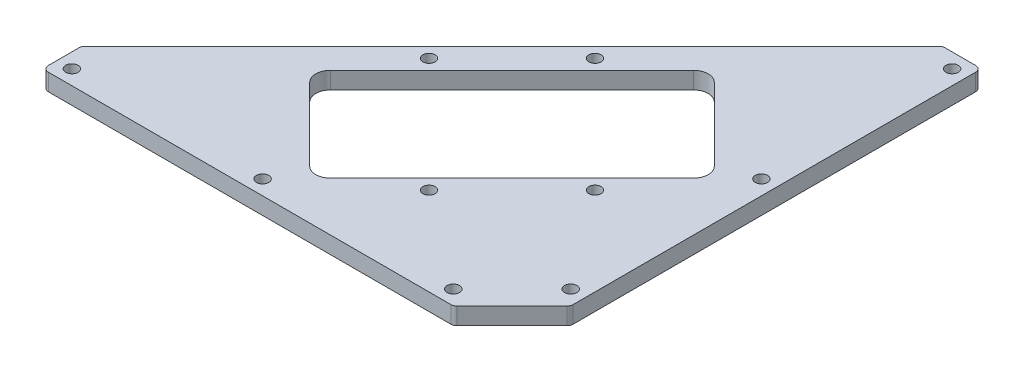
ISO-10303-21;
HEADER;
FILE_DESCRIPTION(('STEP AP214'),'2;1');
FILE_NAME('part.step','',(''),(''),'','','');
FILE_SCHEMA(('AUTOMOTIVE_DESIGN { 1 0 10303 214 1 1 1 1 }'));
ENDSEC;
DATA;
#1=APPLICATION_CONTEXT('core data for automotive mechanical design processes');
#2=APPLICATION_PROTOCOL_DEFINITION('international standard','automotive_design',2000,#1);
#3=PRODUCT_CONTEXT('',#1,'mechanical');
#4=PRODUCT('Part','Part','',(#3));
#5=PRODUCT_RELATED_PRODUCT_CATEGORY('part','',(#4));
#6=PRODUCT_DEFINITION_FORMATION('','',#4);
#7=PRODUCT_DEFINITION_CONTEXT('part definition',#1,'design');
#8=PRODUCT_DEFINITION('design','',#6,#7);
#9=PRODUCT_DEFINITION_SHAPE('','',#8);
#10=(LENGTH_UNIT() NAMED_UNIT(*) SI_UNIT(.MILLI.,.METRE.));
#11=(NAMED_UNIT(*) PLANE_ANGLE_UNIT() SI_UNIT($,.RADIAN.));
#12=(NAMED_UNIT(*) SI_UNIT($,.STERADIAN.) SOLID_ANGLE_UNIT());
#13=UNCERTAINTY_MEASURE_WITH_UNIT(LENGTH_MEASURE(1.E-05),#10,'distance_accuracy_value','');
#14=(GEOMETRIC_REPRESENTATION_CONTEXT(3) GLOBAL_UNCERTAINTY_ASSIGNED_CONTEXT((#13)) GLOBAL_UNIT_ASSIGNED_CONTEXT((#10,
#11,#12)) REPRESENTATION_CONTEXT('',''));
#15=CARTESIAN_POINT('',(0.,0.,0.));
#16=DIRECTION('',(0.,0.,1.));
#17=DIRECTION('',(1.,0.,0.));
#18=AXIS2_PLACEMENT_3D('',#15,#16,#17);
#19=CARTESIAN_POINT('',(-34.4714555828443,5.8,34.4714555828442));
#20=DIRECTION('',(-0.707106781186548,0.,0.707106781186547));
#21=DIRECTION('',(0.707106781186547,0.,0.707106781186548));
#22=AXIS2_PLACEMENT_3D('',#19,#20,#21);
#23=PLANE('',#22);
#24=DIRECTION('',(-0.707106781186547,0.,-0.707106781186548));
#25=VECTOR('',#24,1.);
#26=CARTESIAN_POINT('',(-34.4714555828443,0.,34.4714555828442));
#27=LINE('',#26,#25);
#28=CARTESIAN_POINT('',(-85.7366972188688,0.,-16.7937860531805));
#29=VERTEX_POINT('',#28);
#30=CARTESIAN_POINT('',(-110.485434560398,0.,-41.5425233947097));
#31=VERTEX_POINT('',#30);
#32=EDGE_CURVE('E225',#29,#31,#27,.T.);
#33=ORIENTED_EDGE('',*,*,#32,.T.);
#34=DIRECTION('',(0.,-1.,0.));
#35=VECTOR('',#34,1.);
#36=CARTESIAN_POINT('',(-110.485434560398,5.8,-41.5425233947097));
#37=LINE('',#36,#35);
#38=CARTESIAN_POINT('',(-110.485434560398,5.8,-41.5425233947097));
#39=VERTEX_POINT('',#38);
#40=EDGE_CURVE('E435',#31,#39,#37,.F.);
#41=ORIENTED_EDGE('',*,*,#40,.T.);
#42=DIRECTION('',(-0.707106781186547,0.,-0.707106781186548));
#43=VECTOR('',#42,1.);
#44=CARTESIAN_POINT('',(-34.4714555828443,5.8,34.4714555828442));
#45=LINE('',#44,#43);
#46=CARTESIAN_POINT('',(-85.7366972188688,5.8,-16.7937860531805));
#47=VERTEX_POINT('',#46);
#48=EDGE_CURVE('E343',#47,#39,#45,.T.);
#49=ORIENTED_EDGE('',*,*,#48,.F.);
#50=DIRECTION('',(0.,-1.,0.));
#51=VECTOR('',#50,1.);
#52=CARTESIAN_POINT('',(-85.7366972188688,5.8,-16.7937860531805));
#53=LINE('',#52,#51);
#54=EDGE_CURVE('E432',#47,#29,#53,.T.);
#55=ORIENTED_EDGE('',*,*,#54,.T.);
#56=EDGE_LOOP('',(#33,#41,#49,#55));
#57=FACE_BOUND('',#56,.T.);
#58=ADVANCED_FACE('F41',(#57),#23,.F.);
#59=CARTESIAN_POINT('',(-79.5495128834866,5.8,-79.5495128834866));
#60=DIRECTION('',(-0.707106781186548,0.,-0.707106781186547));
#61=DIRECTION('',(-0.707106781186547,0.,0.707106781186548));
#62=AXIS2_PLACEMENT_3D('',#59,#60,#61);
#63=PLANE('',#62);
#64=DIRECTION('',(0.707106781186547,0.,-0.707106781186548));
#65=VECTOR('',#64,1.);
#66=CARTESIAN_POINT('',(-79.5495128834866,5.8,-79.5495128834866));
#67=LINE('',#66,#65);
#68=CARTESIAN_POINT('',(-110.485434560398,5.8,-48.6135912065751));
#69=VERTEX_POINT('',#68);
#70=CARTESIAN_POINT('',(-48.6135912065751,5.8,-110.485434560398));
#71=VERTEX_POINT('',#70);
#72=EDGE_CURVE('E348',#69,#71,#67,.T.);
#73=ORIENTED_EDGE('',*,*,#72,.F.);
#74=DIRECTION('',(0.,-1.,0.));
#75=VECTOR('',#74,1.);
#76=CARTESIAN_POINT('',(-110.485434560398,0.,-48.6135912065751));
#77=LINE('',#76,#75);
#78=CARTESIAN_POINT('',(-110.485434560398,0.,-48.6135912065751));
#79=VERTEX_POINT('',#78);
#80=EDGE_CURVE('E429',#69,#79,#77,.T.);
#81=ORIENTED_EDGE('',*,*,#80,.T.);
#82=DIRECTION('',(0.707106781186547,0.,-0.707106781186548));
#83=VECTOR('',#82,1.);
#84=CARTESIAN_POINT('',(-79.5495128834866,0.,-79.5495128834866));
#85=LINE('',#84,#83);
#86=CARTESIAN_POINT('',(-48.6135912065751,0.,-110.485434560398));
#87=VERTEX_POINT('',#86);
#88=EDGE_CURVE('E228',#79,#87,#85,.T.);
#89=ORIENTED_EDGE('',*,*,#88,.T.);
#90=DIRECTION('',(0.,-1.,0.));
#91=VECTOR('',#90,1.);
#92=CARTESIAN_POINT('',(-48.6135912065751,5.8,-110.485434560398));
#93=LINE('',#92,#91);
#94=EDGE_CURVE('E427',#87,#71,#93,.F.);
#95=ORIENTED_EDGE('',*,*,#94,.T.);
#96=EDGE_LOOP('',(#73,#81,#89,#95));
#97=FACE_BOUND('',#96,.T.);
#98=ADVANCED_FACE('F469',(#97),#63,.F.);
#99=CARTESIAN_POINT('',(34.4714555828442,5.8,-34.4714555828443));
#100=DIRECTION('',(-0.707106781186547,0.,0.707106781186548));
#101=DIRECTION('',(0.707106781186548,0.,0.707106781186547));
#102=AXIS2_PLACEMENT_3D('',#99,#100,#101);
#103=PLANE('',#102);
#104=DIRECTION('',(-0.707106781186548,0.,-0.707106781186547));
#105=VECTOR('',#104,1.);
#106=CARTESIAN_POINT('',(34.4714555828442,0.,-34.4714555828443));
#107=LINE('',#106,#105);
#108=CARTESIAN_POINT('',(-16.7937860531805,0.,-85.7366972188689));
#109=VERTEX_POINT('',#108);
#110=CARTESIAN_POINT('',(-41.5425233947096,0.,-110.485434560398));
#111=VERTEX_POINT('',#110);
#112=EDGE_CURVE('E231',#109,#111,#107,.T.);
#113=ORIENTED_EDGE('',*,*,#112,.F.);
#114=DIRECTION('',(0.,-1.,0.));
#115=VECTOR('',#114,1.);
#116=CARTESIAN_POINT('',(-16.7937860531805,5.8,-85.7366972188689));
#117=LINE('',#116,#115);
#118=CARTESIAN_POINT('',(-16.7937860531805,5.8,-85.7366972188689));
#119=VERTEX_POINT('',#118);
#120=EDGE_CURVE('E62',#109,#119,#117,.F.);
#121=ORIENTED_EDGE('',*,*,#120,.T.);
#122=DIRECTION('',(-0.707106781186548,0.,-0.707106781186547));
#123=VECTOR('',#122,1.);
#124=CARTESIAN_POINT('',(34.4714555828442,5.8,-34.4714555828443));
#125=LINE('',#124,#123);
#126=CARTESIAN_POINT('',(-41.5425233947096,5.8,-110.485434560398));
#127=VERTEX_POINT('',#126);
#128=EDGE_CURVE('E358',#119,#127,#125,.T.);
#129=ORIENTED_EDGE('',*,*,#128,.T.);
#130=DIRECTION('',(0.,-1.,0.));
#131=VECTOR('',#130,1.);
#132=CARTESIAN_POINT('',(-41.5425233947096,5.8,-110.485434560398));
#133=LINE('',#132,#131);
#134=EDGE_CURVE('E442',#127,#111,#133,.T.);
#135=ORIENTED_EDGE('',*,*,#134,.T.);
#136=EDGE_LOOP('',(#113,#121,#129,#135));
#137=FACE_BOUND('',#136,.T.);
#138=ADVANCED_FACE('F471',(#137),#103,.T.);
#139=CARTESIAN_POINT('',(-86.620580695352,5.8,-86.620580695352));
#140=DIRECTION('',(-0.707106781186547,0.,-0.707106781186547));
#141=DIRECTION('',(-0.707106781186548,0.,0.707106781186548));
#142=AXIS2_PLACEMENT_3D('',#139,#140,#141);
#143=PLANE('',#142);
#144=DIRECTION('',(0.707106781186548,0.,-0.707106781186548));
#145=VECTOR('',#144,1.);
#146=CARTESIAN_POINT('',(-86.620580695352,5.8,-86.620580695352));
#147=LINE('',#146,#145);
#148=CARTESIAN_POINT('',(-159.414213562373,5.8,-13.826947828331));
#149=VERTEX_POINT('',#148);
#150=CARTESIAN_POINT('',(-13.826947828331,5.8,-159.414213562373));
#151=VERTEX_POINT('',#150);
#152=EDGE_CURVE('E258',#149,#151,#147,.T.);
#153=ORIENTED_EDGE('',*,*,#152,.T.);
#154=DIRECTION('',(0.,-1.,0.));
#155=VECTOR('',#154,1.);
#156=CARTESIAN_POINT('',(-13.826947828331,0.,-159.414213562373));
#157=LINE('',#156,#155);
#158=CARTESIAN_POINT('',(-13.826947828331,0.,-159.414213562373));
#159=VERTEX_POINT('',#158);
#160=EDGE_CURVE('E412',#151,#159,#157,.T.);
#161=ORIENTED_EDGE('',*,*,#160,.T.);
#162=DIRECTION('',(0.707106781186548,0.,-0.707106781186548));
#163=VECTOR('',#162,1.);
#164=CARTESIAN_POINT('',(-86.620580695352,0.,-86.620580695352));
#165=LINE('',#164,#163);
#166=CARTESIAN_POINT('',(-159.414213562373,0.,-13.826947828331));
#167=VERTEX_POINT('',#166);
#168=EDGE_CURVE('E393',#167,#159,#165,.T.);
#169=ORIENTED_EDGE('',*,*,#168,.F.);
#170=DIRECTION('',(0.,-1.,0.));
#171=VECTOR('',#170,1.);
#172=CARTESIAN_POINT('',(-159.414213562373,5.8,-13.826947828331));
#173=LINE('',#172,#171);
#174=EDGE_CURVE('E411',#167,#149,#173,.F.);
#175=ORIENTED_EDGE('',*,*,#174,.T.);
#176=EDGE_LOOP('',(#153,#161,#169,#175));
#177=FACE_BOUND('',#176,.T.);
#178=ADVANCED_FACE('F541',(#177),#143,.T.);
#179=CARTESIAN_POINT('',(-160.,5.8,0.));
#180=DIRECTION('',(-1.,0.,0.));
#181=DIRECTION('',(0.,0.,1.));
#182=AXIS2_PLACEMENT_3D('',#179,#180,#181);
#183=PLANE('',#182);
#184=DIRECTION('',(0.,0.,-1.));
#185=VECTOR('',#184,1.);
#186=CARTESIAN_POINT('',(-160.,0.,0.));
#187=LINE('',#186,#185);
#188=CARTESIAN_POINT('',(-160.,0.,-2.00000000000006));
#189=VERTEX_POINT('',#188);
#190=CARTESIAN_POINT('',(-160.,0.,-12.4127342659579));
#191=VERTEX_POINT('',#190);
#192=EDGE_CURVE('E396',#189,#191,#187,.T.);
#193=ORIENTED_EDGE('',*,*,#192,.F.);
#194=DIRECTION('',(0.,-1.,0.));
#195=VECTOR('',#194,1.);
#196=CARTESIAN_POINT('',(-160.,5.8,-2.00000000000006));
#197=LINE('',#196,#195);
#198=CARTESIAN_POINT('',(-160.,5.8,-2.00000000000006));
#199=VERTEX_POINT('',#198);
#200=EDGE_CURVE('E425',#189,#199,#197,.F.);
#201=ORIENTED_EDGE('',*,*,#200,.T.);
#202=DIRECTION('',(0.,0.,-1.));
#203=VECTOR('',#202,1.);
#204=CARTESIAN_POINT('',(-160.,5.8,0.));
#205=LINE('',#204,#203);
#206=CARTESIAN_POINT('',(-160.,5.8,-12.4127342659579));
#207=VERTEX_POINT('',#206);
#208=EDGE_CURVE('E286',#199,#207,#205,.T.);
#209=ORIENTED_EDGE('',*,*,#208,.T.);
#210=DIRECTION('',(0.,-1.,0.));
#211=VECTOR('',#210,1.);
#212=CARTESIAN_POINT('',(-160.,5.8,-12.4127342659579));
#213=LINE('',#212,#211);
#214=EDGE_CURVE('E422',#207,#191,#213,.T.);
#215=ORIENTED_EDGE('',*,*,#214,.T.);
#216=EDGE_LOOP('',(#193,#201,#209,#215));
#217=FACE_BOUND('',#216,.T.);
#218=ADVANCED_FACE('F538',(#217),#183,.T.);
#219=CARTESIAN_POINT('',(0.,5.8,0.));
#220=DIRECTION('',(0.,0.,-1.));
#221=DIRECTION('',(-1.,0.,0.));
#222=AXIS2_PLACEMENT_3D('',#219,#220,#221);
#223=PLANE('',#222);
#224=DIRECTION('',(1.,0.,0.));
#225=VECTOR('',#224,1.);
#226=CARTESIAN_POINT('',(0.,0.,0.));
#227=LINE('',#226,#225);
#228=CARTESIAN_POINT('',(-158.,0.,0.));
#229=VERTEX_POINT('',#228);
#230=CARTESIAN_POINT('',(-20.8284271247462,0.,0.));
#231=VERTEX_POINT('',#230);
#232=EDGE_CURVE('E213',#229,#231,#227,.T.);
#233=ORIENTED_EDGE('',*,*,#232,.T.);
#234=DIRECTION('',(0.,-1.,0.));
#235=VECTOR('',#234,1.);
#236=CARTESIAN_POINT('',(-20.8284271247462,5.8,0.));
#237=LINE('',#236,#235);
#238=CARTESIAN_POINT('',(-20.8284271247462,5.8,0.));
#239=VERTEX_POINT('',#238);
#240=EDGE_CURVE('E405',#231,#239,#237,.F.);
#241=ORIENTED_EDGE('',*,*,#240,.T.);
#242=DIRECTION('',(1.,0.,0.));
#243=VECTOR('',#242,1.);
#244=CARTESIAN_POINT('',(0.,5.8,0.));
#245=LINE('',#244,#243);
#246=CARTESIAN_POINT('',(-158.,5.8,0.));
#247=VERTEX_POINT('',#246);
#248=EDGE_CURVE('E291',#247,#239,#245,.T.);
#249=ORIENTED_EDGE('',*,*,#248,.F.);
#250=DIRECTION('',(0.,-1.,0.));
#251=VECTOR('',#250,1.);
#252=CARTESIAN_POINT('',(-158.,0.,0.));
#253=LINE('',#252,#251);
#254=EDGE_CURVE('E316',#247,#229,#253,.T.);
#255=ORIENTED_EDGE('',*,*,#254,.T.);
#256=EDGE_LOOP('',(#233,#241,#249,#255));
#257=FACE_BOUND('',#256,.T.);
#258=ADVANCED_FACE('F403',(#257),#223,.F.);
#259=CARTESIAN_POINT('',(-10.,5.8,-10.));
#260=DIRECTION('',(-0.707106781186547,0.,-0.707106781186547));
#261=DIRECTION('',(-0.707106781186548,0.,0.707106781186548));
#262=AXIS2_PLACEMENT_3D('',#259,#260,#261);
#263=PLANE('',#262);
#264=DIRECTION('',(0.707106781186548,0.,-0.707106781186548));
#265=VECTOR('',#264,1.);
#266=CARTESIAN_POINT('',(-10.,0.,-10.));
#267=LINE('',#266,#265);
#268=CARTESIAN_POINT('',(-19.4142135623731,0.,-0.585786437626914));
#269=VERTEX_POINT('',#268);
#270=CARTESIAN_POINT('',(-0.585786437626907,0.,-19.4142135623731));
#271=VERTEX_POINT('',#270);
#272=EDGE_CURVE('E208',#269,#271,#267,.T.);
#273=ORIENTED_EDGE('',*,*,#272,.T.);
#274=DIRECTION('',(0.,-1.,0.));
#275=VECTOR('',#274,1.);
#276=CARTESIAN_POINT('',(-0.585786437626908,5.8,-19.4142135623731));
#277=LINE('',#276,#275);
#278=CARTESIAN_POINT('',(-0.585786437626907,5.8,-19.4142135623731));
#279=VERTEX_POINT('',#278);
#280=EDGE_CURVE('E184',#271,#279,#277,.F.);
#281=ORIENTED_EDGE('',*,*,#280,.T.);
#282=DIRECTION('',(0.707106781186548,0.,-0.707106781186548));
#283=VECTOR('',#282,1.);
#284=CARTESIAN_POINT('',(-10.,5.8,-10.));
#285=LINE('',#284,#283);
#286=CARTESIAN_POINT('',(-19.4142135623731,5.8,-0.585786437626914));
#287=VERTEX_POINT('',#286);
#288=EDGE_CURVE('E297',#287,#279,#285,.T.);
#289=ORIENTED_EDGE('',*,*,#288,.F.);
#290=DIRECTION('',(0.,-1.,0.));
#291=VECTOR('',#290,1.);
#292=CARTESIAN_POINT('',(-19.4142135623731,5.8,-0.585786437626915));
#293=LINE('',#292,#291);
#294=EDGE_CURVE('E189',#287,#269,#293,.T.);
#295=ORIENTED_EDGE('',*,*,#294,.T.);
#296=EDGE_LOOP('',(#273,#281,#289,#295));
#297=FACE_BOUND('',#296,.T.);
#298=ADVANCED_FACE('F532',(#297),#263,.F.);
#299=CARTESIAN_POINT('',(0.,5.8,0.));
#300=DIRECTION('',(-1.,0.,0.));
#301=DIRECTION('',(0.,0.,1.));
#302=AXIS2_PLACEMENT_3D('',#299,#300,#301);
#303=PLANE('',#302);
#304=DIRECTION('',(0.,0.,-1.));
#305=VECTOR('',#304,1.);
#306=CARTESIAN_POINT('',(0.,5.8,0.));
#307=LINE('',#306,#305);
#308=CARTESIAN_POINT('',(0.,5.8,-20.8284271247462));
#309=VERTEX_POINT('',#308);
#310=CARTESIAN_POINT('',(0.,5.8,-158.));
#311=VERTEX_POINT('',#310);
#312=EDGE_CURVE('E199',#309,#311,#307,.T.);
#313=ORIENTED_EDGE('',*,*,#312,.F.);
#314=DIRECTION('',(0.,-1.,0.));
#315=VECTOR('',#314,1.);
#316=CARTESIAN_POINT('',(0.,5.8,-20.8284271247462));
#317=LINE('',#316,#315);
#318=CARTESIAN_POINT('',(0.,0.,-20.8284271247462));
#319=VERTEX_POINT('',#318);
#320=EDGE_CURVE('E183',#309,#319,#317,.T.);
#321=ORIENTED_EDGE('',*,*,#320,.T.);
#322=DIRECTION('',(0.,0.,-1.));
#323=VECTOR('',#322,1.);
#324=CARTESIAN_POINT('',(0.,0.,0.));
#325=LINE('',#324,#323);
#326=CARTESIAN_POINT('',(0.,0.,-158.));
#327=VERTEX_POINT('',#326);
#328=EDGE_CURVE('E196',#319,#327,#325,.T.);
#329=ORIENTED_EDGE('',*,*,#328,.T.);
#330=DIRECTION('',(0.,-1.,0.));
#331=VECTOR('',#330,1.);
#332=CARTESIAN_POINT('',(0.,5.8,-158.));
#333=LINE('',#332,#331);
#334=EDGE_CURVE('E201',#327,#311,#333,.F.);
#335=ORIENTED_EDGE('',*,*,#334,.T.);
#336=EDGE_LOOP('',(#313,#321,#329,#335));
#337=FACE_BOUND('',#336,.T.);
#338=ADVANCED_FACE('F195',(#337),#303,.F.);
#339=CARTESIAN_POINT('',(-5.,5.8,-155.));
#340=DIRECTION('',(0.,-1.,0.));
#341=DIRECTION('',(0.,0.,-1.));
#342=AXIS2_PLACEMENT_3D('',#339,#340,#341);
#343=CYLINDRICAL_SURFACE('',#342,2.1);
#344=CARTESIAN_POINT('',(-5.,5.8,-155.));
#345=DIRECTION('',(0.,1.,0.));
#346=DIRECTION('',(0.,0.,1.));
#347=AXIS2_PLACEMENT_3D('',#344,#345,#346);
#348=CIRCLE('',#347,2.1);
#349=CARTESIAN_POINT('',(-5.,5.8,-152.9));
#350=VERTEX_POINT('',#349);
#351=EDGE_CURVE('E385',#350,#350,#348,.T.);
#352=ORIENTED_EDGE('',*,*,#351,.T.);
#353=EDGE_LOOP('',(#352));
#354=FACE_BOUND('',#353,.T.);
#355=CARTESIAN_POINT('',(-5.,0.,-155.));
#356=DIRECTION('',(0.,1.,0.));
#357=DIRECTION('',(0.,0.,1.));
#358=AXIS2_PLACEMENT_3D('',#355,#356,#357);
#359=CIRCLE('',#358,2.1);
#360=CARTESIAN_POINT('',(-5.,0.,-152.9));
#361=VERTEX_POINT('',#360);
#362=EDGE_CURVE('E252',#361,#361,#359,.T.);
#363=ORIENTED_EDGE('',*,*,#362,.F.);
#364=EDGE_LOOP('',(#363));
#365=FACE_BOUND('',#364,.T.);
#366=ADVANCED_FACE('F531',(#354,#365),#343,.F.);
#367=CARTESIAN_POINT('',(-30.0520382004283,5.8,-58.3363094478902));
#368=DIRECTION('',(0.,-1.,0.));
#369=DIRECTION('',(0.,0.,-1.));
#370=AXIS2_PLACEMENT_3D('',#367,#368,#369);
#371=CYLINDRICAL_SURFACE('',#370,2.09999999999999);
#372=CARTESIAN_POINT('',(-30.0520382004283,5.8,-58.3363094478902));
#373=DIRECTION('',(0.,1.,0.));
#374=DIRECTION('',(0.,0.,1.));
#375=AXIS2_PLACEMENT_3D('',#372,#373,#374);
#376=CIRCLE('',#375,2.09999999999999);
#377=CARTESIAN_POINT('',(-30.0520382004283,5.8,-56.2363094478902));
#378=VERTEX_POINT('',#377);
#379=EDGE_CURVE('E382',#378,#378,#376,.F.);
#380=ORIENTED_EDGE('',*,*,#379,.F.);
#381=EDGE_LOOP('',(#380));
#382=FACE_BOUND('',#381,.T.);
#383=CARTESIAN_POINT('',(-30.0520382004283,0.,-58.3363094478902));
#384=DIRECTION('',(0.,1.,0.));
#385=DIRECTION('',(0.,0.,1.));
#386=AXIS2_PLACEMENT_3D('',#383,#384,#385);
#387=CIRCLE('',#386,2.09999999999999);
#388=CARTESIAN_POINT('',(-30.0520382004283,0.,-56.2363094478902));
#389=VERTEX_POINT('',#388);
#390=EDGE_CURVE('E249',#389,#389,#387,.F.);
#391=ORIENTED_EDGE('',*,*,#390,.T.);
#392=EDGE_LOOP('',(#391));
#393=FACE_BOUND('',#392,.T.);
#394=ADVANCED_FACE('F609',(#382,#393),#371,.F.);
#395=CARTESIAN_POINT('',(-68.9429111656884,5.8,-97.2271824131503));
#396=DIRECTION('',(0.,-1.,0.));
#397=DIRECTION('',(0.,0.,-1.));
#398=AXIS2_PLACEMENT_3D('',#395,#396,#397);
#399=CYLINDRICAL_SURFACE('',#398,2.1);
#400=CARTESIAN_POINT('',(-68.9429111656884,5.8,-97.2271824131503));
#401=DIRECTION('',(0.,1.,0.));
#402=DIRECTION('',(0.,0.,1.));
#403=AXIS2_PLACEMENT_3D('',#400,#401,#402);
#404=CIRCLE('',#403,2.1);
#405=CARTESIAN_POINT('',(-68.9429111656884,5.8,-95.1271824131503));
#406=VERTEX_POINT('',#405);
#407=EDGE_CURVE('E377',#406,#406,#404,.T.);
#408=ORIENTED_EDGE('',*,*,#407,.T.);
#409=EDGE_LOOP('',(#408));
#410=FACE_BOUND('',#409,.T.);
#411=CARTESIAN_POINT('',(-68.9429111656884,0.,-97.2271824131503));
#412=DIRECTION('',(0.,1.,0.));
#413=DIRECTION('',(0.,0.,1.));
#414=AXIS2_PLACEMENT_3D('',#411,#412,#413);
#415=CIRCLE('',#414,2.1);
#416=CARTESIAN_POINT('',(-68.9429111656884,0.,-95.1271824131503));
#417=VERTEX_POINT('',#416);
#418=EDGE_CURVE('E246',#417,#417,#415,.T.);
#419=ORIENTED_EDGE('',*,*,#418,.F.);
#420=EDGE_LOOP('',(#419));
#421=FACE_BOUND('',#420,.T.);
#422=ADVANCED_FACE('F613',(#410,#421),#399,.F.);
#423=CARTESIAN_POINT('',(-90.,5.8,-5.00000000000002));
#424=DIRECTION('',(0.,-1.,0.));
#425=DIRECTION('',(0.,0.,-1.));
#426=AXIS2_PLACEMENT_3D('',#423,#424,#425);
#427=CYLINDRICAL_SURFACE('',#426,2.1);
#428=CARTESIAN_POINT('',(-90.,5.8,-5.00000000000002));
#429=DIRECTION('',(0.,1.,0.));
#430=DIRECTION('',(0.,0.,1.));
#431=AXIS2_PLACEMENT_3D('',#428,#429,#430);
#432=CIRCLE('',#431,2.1);
#433=CARTESIAN_POINT('',(-90.,5.8,-2.90000000000001));
#434=VERTEX_POINT('',#433);
#435=EDGE_CURVE('E375',#434,#434,#432,.F.);
#436=ORIENTED_EDGE('',*,*,#435,.F.);
#437=EDGE_LOOP('',(#436));
#438=FACE_BOUND('',#437,.T.);
#439=CARTESIAN_POINT('',(-90.,0.,-5.00000000000002));
#440=DIRECTION('',(0.,1.,0.));
#441=DIRECTION('',(0.,0.,1.));
#442=AXIS2_PLACEMENT_3D('',#439,#440,#441);
#443=CIRCLE('',#442,2.1);
#444=CARTESIAN_POINT('',(-90.,0.,-2.90000000000001));
#445=VERTEX_POINT('',#444);
#446=EDGE_CURVE('E243',#445,#445,#443,.F.);
#447=ORIENTED_EDGE('',*,*,#446,.T.);
#448=EDGE_LOOP('',(#447));
#449=FACE_BOUND('',#448,.T.);
#450=ADVANCED_FACE('F617',(#438,#449),#427,.F.);
#451=CARTESIAN_POINT('',(-5.,5.8,-90.));
#452=DIRECTION('',(0.,-1.,0.));
#453=DIRECTION('',(0.,0.,-1.));
#454=AXIS2_PLACEMENT_3D('',#451,#452,#453);
#455=CYLINDRICAL_SURFACE('',#454,2.1);
#456=CARTESIAN_POINT('',(-5.,5.8,-90.));
#457=DIRECTION('',(0.,1.,0.));
#458=DIRECTION('',(0.,0.,1.));
#459=AXIS2_PLACEMENT_3D('',#456,#457,#458);
#460=CIRCLE('',#459,2.1);
#461=CARTESIAN_POINT('',(-5.,5.8,-87.9));
#462=VERTEX_POINT('',#461);
#463=EDGE_CURVE('E370',#462,#462,#460,.T.);
#464=ORIENTED_EDGE('',*,*,#463,.T.);
#465=EDGE_LOOP('',(#464));
#466=FACE_BOUND('',#465,.T.);
#467=CARTESIAN_POINT('',(-5.,0.,-90.));
#468=DIRECTION('',(0.,1.,0.));
#469=DIRECTION('',(0.,0.,1.));
#470=AXIS2_PLACEMENT_3D('',#467,#468,#469);
#471=CIRCLE('',#470,2.1);
#472=CARTESIAN_POINT('',(-5.,0.,-87.9));
#473=VERTEX_POINT('',#472);
#474=EDGE_CURVE('E240',#473,#473,#471,.T.);
#475=ORIENTED_EDGE('',*,*,#474,.F.);
#476=EDGE_LOOP('',(#475));
#477=FACE_BOUND('',#476,.T.);
#478=ADVANCED_FACE('F621',(#466,#477),#455,.F.);
#479=CARTESIAN_POINT('',(-5.,5.8,-25.));
#480=DIRECTION('',(0.,-1.,0.));
#481=DIRECTION('',(0.,0.,-1.));
#482=AXIS2_PLACEMENT_3D('',#479,#480,#481);
#483=CYLINDRICAL_SURFACE('',#482,2.1);
#484=CARTESIAN_POINT('',(-5.,5.8,-25.));
#485=DIRECTION('',(0.,1.,0.));
#486=DIRECTION('',(0.,0.,1.));
#487=AXIS2_PLACEMENT_3D('',#484,#485,#486);
#488=CIRCLE('',#487,2.1);
#489=CARTESIAN_POINT('',(-5.,5.8,-22.9));
#490=VERTEX_POINT('',#489);
#491=EDGE_CURVE('E365',#490,#490,#488,.T.);
#492=ORIENTED_EDGE('',*,*,#491,.T.);
#493=EDGE_LOOP('',(#492));
#494=FACE_BOUND('',#493,.T.);
#495=CARTESIAN_POINT('',(-5.,0.,-25.));
#496=DIRECTION('',(0.,1.,0.));
#497=DIRECTION('',(0.,0.,1.));
#498=AXIS2_PLACEMENT_3D('',#495,#496,#497);
#499=CIRCLE('',#498,2.1);
#500=CARTESIAN_POINT('',(-5.,0.,-22.9));
#501=VERTEX_POINT('',#500);
#502=EDGE_CURVE('E237',#501,#501,#499,.T.);
#503=ORIENTED_EDGE('',*,*,#502,.F.);
#504=EDGE_LOOP('',(#503));
#505=FACE_BOUND('',#504,.T.);
#506=ADVANCED_FACE('F625',(#494,#505),#483,.F.);
#507=CARTESIAN_POINT('',(-47.7297077300919,5.8,-47.7297077300919));
#508=DIRECTION('',(-0.707106781186548,0.,-0.707106781186547));
#509=DIRECTION('',(-0.707106781186547,0.,0.707106781186548));
#510=AXIS2_PLACEMENT_3D('',#507,#508,#509);
#511=PLANE('',#510);
#512=DIRECTION('',(0.707106781186547,0.,-0.707106781186548));
#513=VECTOR('',#512,1.);
#514=CARTESIAN_POINT('',(-47.7297077300919,0.,-47.7297077300919));
#515=LINE('',#514,#513);
#516=CARTESIAN_POINT('',(-78.6656294070034,0.,-16.7937860531805));
#517=VERTEX_POINT('',#516);
#518=CARTESIAN_POINT('',(-16.7937860531805,0.,-78.6656294070034));
#519=VERTEX_POINT('',#518);
#520=EDGE_CURVE('E234',#517,#519,#515,.T.);
#521=ORIENTED_EDGE('',*,*,#520,.F.);
#522=DIRECTION('',(0.,-1.,0.));
#523=VECTOR('',#522,1.);
#524=CARTESIAN_POINT('',(-78.6656294070034,5.8,-16.7937860531805));
#525=LINE('',#524,#523);
#526=CARTESIAN_POINT('',(-78.6656294070034,5.8,-16.7937860531805));
#527=VERTEX_POINT('',#526);
#528=EDGE_CURVE('E440',#517,#527,#525,.F.);
#529=ORIENTED_EDGE('',*,*,#528,.T.);
#530=DIRECTION('',(0.707106781186547,0.,-0.707106781186548));
#531=VECTOR('',#530,1.);
#532=CARTESIAN_POINT('',(-47.7297077300919,5.8,-47.7297077300919));
#533=LINE('',#532,#531);
#534=CARTESIAN_POINT('',(-16.7937860531805,5.8,-78.6656294070034));
#535=VERTEX_POINT('',#534);
#536=EDGE_CURVE('E361',#527,#535,#533,.T.);
#537=ORIENTED_EDGE('',*,*,#536,.T.);
#538=DIRECTION('',(0.,-1.,0.));
#539=VECTOR('',#538,1.);
#540=CARTESIAN_POINT('',(-16.7937860531805,0.,-78.6656294070034));
#541=LINE('',#540,#539);
#542=EDGE_CURVE('E437',#535,#519,#541,.T.);
#543=ORIENTED_EDGE('',*,*,#542,.T.);
#544=EDGE_LOOP('',(#521,#529,#537,#543));
#545=FACE_BOUND('',#544,.T.);
#546=ADVANCED_FACE('F481',(#545),#511,.T.);
#547=CARTESIAN_POINT('',(-25.,5.8,-5.));
#548=DIRECTION('',(0.,-1.,0.));
#549=DIRECTION('',(0.,0.,-1.));
#550=AXIS2_PLACEMENT_3D('',#547,#548,#549);
#551=CYLINDRICAL_SURFACE('',#550,2.1);
#552=CARTESIAN_POINT('',(-25.,5.8,-5.));
#553=DIRECTION('',(0.,1.,0.));
#554=DIRECTION('',(0.,0.,1.));
#555=AXIS2_PLACEMENT_3D('',#552,#553,#554);
#556=CIRCLE('',#555,2.1);
#557=CARTESIAN_POINT('',(-25.,5.8,-2.9));
#558=VERTEX_POINT('',#557);
#559=EDGE_CURVE('E339',#558,#558,#556,.F.);
#560=ORIENTED_EDGE('',*,*,#559,.F.);
#561=EDGE_LOOP('',(#560));
#562=FACE_BOUND('',#561,.T.);
#563=CARTESIAN_POINT('',(-25.,0.,-5.));
#564=DIRECTION('',(0.,1.,0.));
#565=DIRECTION('',(0.,0.,1.));
#566=AXIS2_PLACEMENT_3D('',#563,#564,#565);
#567=CIRCLE('',#566,2.1);
#568=CARTESIAN_POINT('',(-25.,0.,-2.9));
#569=VERTEX_POINT('',#568);
#570=EDGE_CURVE('E222',#569,#569,#567,.F.);
#571=ORIENTED_EDGE('',*,*,#570,.T.);
#572=EDGE_LOOP('',(#571));
#573=FACE_BOUND('',#572,.T.);
#574=ADVANCED_FACE('F512',(#562,#573),#551,.F.);
#575=CARTESIAN_POINT('',(-58.3363094478902,5.8,-30.0520382004283));
#576=DIRECTION('',(0.,-1.,0.));
#577=DIRECTION('',(0.,0.,-1.));
#578=AXIS2_PLACEMENT_3D('',#575,#576,#577);
#579=CYLINDRICAL_SURFACE('',#578,2.1);
#580=CARTESIAN_POINT('',(-58.3363094478902,5.8,-30.0520382004283));
#581=DIRECTION('',(0.,1.,0.));
#582=DIRECTION('',(0.,0.,1.));
#583=AXIS2_PLACEMENT_3D('',#580,#581,#582);
#584=CIRCLE('',#583,2.1);
#585=CARTESIAN_POINT('',(-58.3363094478902,5.8,-27.9520382004283));
#586=VERTEX_POINT('',#585);
#587=EDGE_CURVE('E334',#586,#586,#584,.T.);
#588=ORIENTED_EDGE('',*,*,#587,.T.);
#589=EDGE_LOOP('',(#588));
#590=FACE_BOUND('',#589,.T.);
#591=CARTESIAN_POINT('',(-58.3363094478902,0.,-30.0520382004283));
#592=DIRECTION('',(0.,1.,0.));
#593=DIRECTION('',(0.,0.,1.));
#594=AXIS2_PLACEMENT_3D('',#591,#592,#593);
#595=CIRCLE('',#594,2.1);
#596=CARTESIAN_POINT('',(-58.3363094478902,0.,-27.9520382004283));
#597=VERTEX_POINT('',#596);
#598=EDGE_CURVE('E219',#597,#597,#595,.T.);
#599=ORIENTED_EDGE('',*,*,#598,.F.);
#600=EDGE_LOOP('',(#599));
#601=FACE_BOUND('',#600,.T.);
#602=ADVANCED_FACE('F515',(#590,#601),#579,.F.);
#603=CARTESIAN_POINT('',(-97.2271824131503,5.8,-68.9429111656884));
#604=DIRECTION('',(0.,-1.,0.));
#605=DIRECTION('',(0.,0.,-1.));
#606=AXIS2_PLACEMENT_3D('',#603,#604,#605);
#607=CYLINDRICAL_SURFACE('',#606,2.10000000000002);
#608=CARTESIAN_POINT('',(-97.2271824131503,5.8,-68.9429111656884));
#609=DIRECTION('',(0.,1.,0.));
#610=DIRECTION('',(0.,0.,1.));
#611=AXIS2_PLACEMENT_3D('',#608,#609,#610);
#612=CIRCLE('',#611,2.10000000000002);
#613=CARTESIAN_POINT('',(-97.2271824131503,5.8,-66.8429111656884));
#614=VERTEX_POINT('',#613);
#615=EDGE_CURVE('E331',#614,#614,#612,.F.);
#616=ORIENTED_EDGE('',*,*,#615,.F.);
#617=EDGE_LOOP('',(#616));
#618=FACE_BOUND('',#617,.T.);
#619=CARTESIAN_POINT('',(-97.2271824131503,0.,-68.9429111656884));
#620=DIRECTION('',(0.,1.,0.));
#621=DIRECTION('',(0.,0.,1.));
#622=AXIS2_PLACEMENT_3D('',#619,#620,#621);
#623=CIRCLE('',#622,2.10000000000002);
#624=CARTESIAN_POINT('',(-97.2271824131503,0.,-66.8429111656884));
#625=VERTEX_POINT('',#624);
#626=EDGE_CURVE('E211',#625,#625,#623,.F.);
#627=ORIENTED_EDGE('',*,*,#626,.T.);
#628=EDGE_LOOP('',(#627));
#629=FACE_BOUND('',#628,.T.);
#630=ADVANCED_FACE('F519',(#618,#629),#607,.F.);
#631=CARTESIAN_POINT('',(0.,5.8,-160.));
#632=DIRECTION('',(0.,0.,1.));
#633=DIRECTION('',(1.,0.,0.));
#634=AXIS2_PLACEMENT_3D('',#631,#632,#633);
#635=PLANE('',#634);
#636=DIRECTION('',(-1.,0.,0.));
#637=VECTOR('',#636,1.);
#638=CARTESIAN_POINT('',(0.,0.,-160.));
#639=LINE('',#638,#637);
#640=CARTESIAN_POINT('',(-2.00000000000003,0.,-160.));
#641=VERTEX_POINT('',#640);
#642=CARTESIAN_POINT('',(-12.4127342659579,0.,-160.));
#643=VERTEX_POINT('',#642);
#644=EDGE_CURVE('E207',#641,#643,#639,.T.);
#645=ORIENTED_EDGE('',*,*,#644,.T.);
#646=DIRECTION('',(0.,-1.,0.));
#647=VECTOR('',#646,1.);
#648=CARTESIAN_POINT('',(-12.4127342659579,5.8,-160.));
#649=LINE('',#648,#647);
#650=CARTESIAN_POINT('',(-12.4127342659579,5.8,-160.));
#651=VERTEX_POINT('',#650);
#652=EDGE_CURVE('E420',#643,#651,#649,.F.);
#653=ORIENTED_EDGE('',*,*,#652,.T.);
#654=DIRECTION('',(-1.,0.,0.));
#655=VECTOR('',#654,1.);
#656=CARTESIAN_POINT('',(0.,5.8,-160.));
#657=LINE('',#656,#655);
#658=CARTESIAN_POINT('',(-2.00000000000003,5.8,-160.));
#659=VERTEX_POINT('',#658);
#660=EDGE_CURVE('E326',#659,#651,#657,.T.);
#661=ORIENTED_EDGE('',*,*,#660,.F.);
#662=DIRECTION('',(0.,-1.,0.));
#663=VECTOR('',#662,1.);
#664=CARTESIAN_POINT('',(-2.00000000000003,5.8,-160.));
#665=LINE('',#664,#663);
#666=EDGE_CURVE('E417',#659,#641,#665,.T.);
#667=ORIENTED_EDGE('',*,*,#666,.T.);
#668=EDGE_LOOP('',(#645,#653,#661,#667));
#669=FACE_BOUND('',#668,.T.);
#670=ADVANCED_FACE('F523',(#669),#635,.F.);
#671=CARTESIAN_POINT('',(-155.,5.8,-4.99999999999992));
#672=DIRECTION('',(0.,-1.,0.));
#673=DIRECTION('',(0.,0.,-1.));
#674=AXIS2_PLACEMENT_3D('',#671,#672,#673);
#675=CYLINDRICAL_SURFACE('',#674,2.09999999999999);
#676=CARTESIAN_POINT('',(-155.,5.8,-4.99999999999992));
#677=DIRECTION('',(0.,1.,0.));
#678=DIRECTION('',(0.,0.,1.));
#679=AXIS2_PLACEMENT_3D('',#676,#677,#678);
#680=CIRCLE('',#679,2.09999999999999);
#681=CARTESIAN_POINT('',(-155.,5.8,-2.89999999999993));
#682=VERTEX_POINT('',#681);
#683=EDGE_CURVE('E259',#682,#682,#680,.F.);
#684=ORIENTED_EDGE('',*,*,#683,.F.);
#685=EDGE_LOOP('',(#684));
#686=FACE_BOUND('',#685,.T.);
#687=CARTESIAN_POINT('',(-155.,0.,-4.99999999999992));
#688=DIRECTION('',(0.,1.,0.));
#689=DIRECTION('',(0.,0.,1.));
#690=AXIS2_PLACEMENT_3D('',#687,#688,#689);
#691=CIRCLE('',#690,2.09999999999999);
#692=CARTESIAN_POINT('',(-155.,0.,-2.89999999999993));
#693=VERTEX_POINT('',#692);
#694=EDGE_CURVE('E255',#693,#693,#691,.F.);
#695=ORIENTED_EDGE('',*,*,#694,.T.);
#696=EDGE_LOOP('',(#695));
#697=FACE_BOUND('',#696,.T.);
#698=ADVANCED_FACE('F527',(#686,#697),#675,.F.);
#699=CARTESIAN_POINT('',(0.,5.8,0.));
#700=DIRECTION('',(0.,1.,0.));
#701=DIRECTION('',(0.,0.,1.));
#702=AXIS2_PLACEMENT_3D('',#699,#700,#701);
#703=PLANE('',#702);
#704=ORIENTED_EDGE('',*,*,#288,.T.);
#705=CARTESIAN_POINT('',(-2.,5.8,-20.8284271247462));
#706=DIRECTION('',(0.,1.,0.));
#707=DIRECTION('',(0.,0.,1.));
#708=AXIS2_PLACEMENT_3D('',#705,#706,#707);
#709=CIRCLE('',#708,2.);
#710=EDGE_CURVE('E310',#279,#309,#709,.T.);
#711=ORIENTED_EDGE('',*,*,#710,.T.);
#712=ORIENTED_EDGE('',*,*,#312,.T.);
#713=CARTESIAN_POINT('',(-2.00000000000003,5.8,-158.));
#714=DIRECTION('',(0.,1.,0.));
#715=DIRECTION('',(0.,0.,1.));
#716=AXIS2_PLACEMENT_3D('',#713,#714,#715);
#717=CIRCLE('',#716,2.);
#718=EDGE_CURVE('E567',#311,#659,#717,.T.);
#719=ORIENTED_EDGE('',*,*,#718,.T.);
#720=ORIENTED_EDGE('',*,*,#660,.T.);
#721=CARTESIAN_POINT('',(-12.4127342659579,5.8,-158.));
#722=DIRECTION('',(0.,1.,0.));
#723=DIRECTION('',(0.,0.,1.));
#724=AXIS2_PLACEMENT_3D('',#721,#722,#723);
#725=CIRCLE('',#724,2.);
#726=EDGE_CURVE('E311',#651,#151,#725,.T.);
#727=ORIENTED_EDGE('',*,*,#726,.T.);
#728=ORIENTED_EDGE('',*,*,#152,.F.);
#729=CARTESIAN_POINT('',(-158.,5.8,-12.4127342659579));
#730=DIRECTION('',(0.,1.,0.));
#731=DIRECTION('',(0.,0.,1.));
#732=AXIS2_PLACEMENT_3D('',#729,#730,#731);
#733=CIRCLE('',#732,2.);
#734=EDGE_CURVE('E271',#149,#207,#733,.T.);
#735=ORIENTED_EDGE('',*,*,#734,.T.);
#736=ORIENTED_EDGE('',*,*,#208,.F.);
#737=CARTESIAN_POINT('',(-158.,5.8,-2.00000000000006));
#738=DIRECTION('',(0.,1.,0.));
#739=DIRECTION('',(0.,0.,1.));
#740=AXIS2_PLACEMENT_3D('',#737,#738,#739);
#741=CIRCLE('',#740,2.);
#742=EDGE_CURVE('E275',#199,#247,#741,.T.);
#743=ORIENTED_EDGE('',*,*,#742,.T.);
#744=ORIENTED_EDGE('',*,*,#248,.T.);
#745=CARTESIAN_POINT('',(-20.8284271247462,5.8,-2.00000000000001));
#746=DIRECTION('',(0.,1.,0.));
#747=DIRECTION('',(0.,0.,1.));
#748=AXIS2_PLACEMENT_3D('',#745,#746,#747);
#749=CIRCLE('',#748,2.);
#750=EDGE_CURVE('E305',#239,#287,#749,.T.);
#751=ORIENTED_EDGE('',*,*,#750,.T.);
#752=EDGE_LOOP('',(#704,#711,#712,#719,#720,#727,#728,#735,#736,#743,#744,#751));
#753=FACE_BOUND('',#752,.T.);
#754=ORIENTED_EDGE('',*,*,#615,.T.);
#755=EDGE_LOOP('',(#754));
#756=FACE_BOUND('',#755,.T.);
#757=ORIENTED_EDGE('',*,*,#587,.F.);
#758=EDGE_LOOP('',(#757));
#759=FACE_BOUND('',#758,.T.);
#760=ORIENTED_EDGE('',*,*,#559,.T.);
#761=EDGE_LOOP('',(#760));
#762=FACE_BOUND('',#761,.T.);
#763=ORIENTED_EDGE('',*,*,#536,.F.);
#764=CARTESIAN_POINT('',(-82.2011633129361,5.8,-20.3293199591132));
#765=DIRECTION('',(0.,1.,0.));
#766=DIRECTION('',(0.,0.,1.));
#767=AXIS2_PLACEMENT_3D('',#764,#765,#766);
#768=CIRCLE('',#767,5.);
#769=EDGE_CURVE('E453',#527,#47,#768,.F.);
#770=ORIENTED_EDGE('',*,*,#769,.T.);
#771=ORIENTED_EDGE('',*,*,#48,.T.);
#772=CARTESIAN_POINT('',(-106.949900654465,5.8,-45.0780573006424));
#773=DIRECTION('',(0.,1.,0.));
#774=DIRECTION('',(0.,0.,1.));
#775=AXIS2_PLACEMENT_3D('',#772,#773,#774);
#776=CIRCLE('',#775,5.);
#777=EDGE_CURVE('E448',#39,#69,#776,.F.);
#778=ORIENTED_EDGE('',*,*,#777,.T.);
#779=ORIENTED_EDGE('',*,*,#72,.T.);
#780=CARTESIAN_POINT('',(-45.0780573006424,5.8,-106.949900654465));
#781=DIRECTION('',(0.,1.,0.));
#782=DIRECTION('',(0.,0.,1.));
#783=AXIS2_PLACEMENT_3D('',#780,#781,#782);
#784=CIRCLE('',#783,5.);
#785=EDGE_CURVE('E12',#71,#127,#784,.F.);
#786=ORIENTED_EDGE('',*,*,#785,.T.);
#787=ORIENTED_EDGE('',*,*,#128,.F.);
#788=CARTESIAN_POINT('',(-20.3293199591132,5.8,-82.2011633129361));
#789=DIRECTION('',(0.,1.,0.));
#790=DIRECTION('',(0.,0.,1.));
#791=AXIS2_PLACEMENT_3D('',#788,#789,#790);
#792=CIRCLE('',#791,5.);
#793=EDGE_CURVE('E458',#119,#535,#792,.F.);
#794=ORIENTED_EDGE('',*,*,#793,.T.);
#795=EDGE_LOOP('',(#763,#770,#771,#778,#779,#786,#787,#794));
#796=FACE_BOUND('',#795,.T.);
#797=ORIENTED_EDGE('',*,*,#491,.F.);
#798=EDGE_LOOP('',(#797));
#799=FACE_BOUND('',#798,.T.);
#800=ORIENTED_EDGE('',*,*,#463,.F.);
#801=EDGE_LOOP('',(#800));
#802=FACE_BOUND('',#801,.T.);
#803=ORIENTED_EDGE('',*,*,#435,.T.);
#804=EDGE_LOOP('',(#803));
#805=FACE_BOUND('',#804,.T.);
#806=ORIENTED_EDGE('',*,*,#407,.F.);
#807=EDGE_LOOP('',(#806));
#808=FACE_BOUND('',#807,.T.);
#809=ORIENTED_EDGE('',*,*,#379,.T.);
#810=EDGE_LOOP('',(#809));
#811=FACE_BOUND('',#810,.T.);
#812=ORIENTED_EDGE('',*,*,#351,.F.);
#813=EDGE_LOOP('',(#812));
#814=FACE_BOUND('',#813,.T.);
#815=ORIENTED_EDGE('',*,*,#683,.T.);
#816=EDGE_LOOP('',(#815));
#817=FACE_BOUND('',#816,.T.);
#818=ADVANCED_FACE('F474',(#753,#756,#759,#762,#796,#799,#802,#805,#808,#811,#814,#817),#703,.T.);
#819=CARTESIAN_POINT('',(0.,0.,0.));
#820=DIRECTION('',(0.,1.,0.));
#821=DIRECTION('',(0.,0.,1.));
#822=AXIS2_PLACEMENT_3D('',#819,#820,#821);
#823=PLANE('',#822);
#824=ORIENTED_EDGE('',*,*,#328,.F.);
#825=CARTESIAN_POINT('',(-2.,0.,-20.8284271247462));
#826=DIRECTION('',(0.,1.,0.));
#827=DIRECTION('',(0.,0.,1.));
#828=AXIS2_PLACEMENT_3D('',#825,#826,#827);
#829=CIRCLE('',#828,2.);
#830=EDGE_CURVE('E179',#319,#271,#829,.F.);
#831=ORIENTED_EDGE('',*,*,#830,.T.);
#832=ORIENTED_EDGE('',*,*,#272,.F.);
#833=CARTESIAN_POINT('',(-20.8284271247462,0.,-2.00000000000001));
#834=DIRECTION('',(0.,1.,0.));
#835=DIRECTION('',(0.,0.,1.));
#836=AXIS2_PLACEMENT_3D('',#833,#834,#835);
#837=CIRCLE('',#836,2.);
#838=EDGE_CURVE('E190',#269,#231,#837,.F.);
#839=ORIENTED_EDGE('',*,*,#838,.T.);
#840=ORIENTED_EDGE('',*,*,#232,.F.);
#841=CARTESIAN_POINT('',(-158.,0.,-2.00000000000006));
#842=DIRECTION('',(0.,1.,0.));
#843=DIRECTION('',(0.,0.,1.));
#844=AXIS2_PLACEMENT_3D('',#841,#842,#843);
#845=CIRCLE('',#844,2.);
#846=EDGE_CURVE('E262',#229,#189,#845,.F.);
#847=ORIENTED_EDGE('',*,*,#846,.T.);
#848=ORIENTED_EDGE('',*,*,#192,.T.);
#849=CARTESIAN_POINT('',(-158.,0.,-12.4127342659579));
#850=DIRECTION('',(0.,1.,0.));
#851=DIRECTION('',(0.,0.,1.));
#852=AXIS2_PLACEMENT_3D('',#849,#850,#851);
#853=CIRCLE('',#852,2.);
#854=EDGE_CURVE('E200',#191,#167,#853,.F.);
#855=ORIENTED_EDGE('',*,*,#854,.T.);
#856=ORIENTED_EDGE('',*,*,#168,.T.);
#857=CARTESIAN_POINT('',(-12.4127342659579,0.,-158.));
#858=DIRECTION('',(0.,1.,0.));
#859=DIRECTION('',(0.,0.,1.));
#860=AXIS2_PLACEMENT_3D('',#857,#858,#859);
#861=CIRCLE('',#860,2.);
#862=EDGE_CURVE('E265',#159,#643,#861,.F.);
#863=ORIENTED_EDGE('',*,*,#862,.T.);
#864=ORIENTED_EDGE('',*,*,#644,.F.);
#865=CARTESIAN_POINT('',(-2.00000000000003,0.,-158.));
#866=DIRECTION('',(0.,1.,0.));
#867=DIRECTION('',(0.,0.,1.));
#868=AXIS2_PLACEMENT_3D('',#865,#866,#867);
#869=CIRCLE('',#868,2.);
#870=EDGE_CURVE('E206',#641,#327,#869,.F.);
#871=ORIENTED_EDGE('',*,*,#870,.T.);
#872=EDGE_LOOP('',(#824,#831,#832,#839,#840,#847,#848,#855,#856,#863,#864,#871));
#873=FACE_BOUND('',#872,.T.);
#874=ORIENTED_EDGE('',*,*,#626,.F.);
#875=EDGE_LOOP('',(#874));
#876=FACE_BOUND('',#875,.T.);
#877=ORIENTED_EDGE('',*,*,#598,.T.);
#878=EDGE_LOOP('',(#877));
#879=FACE_BOUND('',#878,.T.);
#880=ORIENTED_EDGE('',*,*,#570,.F.);
#881=EDGE_LOOP('',(#880));
#882=FACE_BOUND('',#881,.T.);
#883=ORIENTED_EDGE('',*,*,#32,.F.);
#884=CARTESIAN_POINT('',(-82.2011633129361,0.,-20.3293199591132));
#885=DIRECTION('',(0.,1.,0.));
#886=DIRECTION('',(0.,0.,1.));
#887=AXIS2_PLACEMENT_3D('',#884,#885,#886);
#888=CIRCLE('',#887,5.);
#889=EDGE_CURVE('E451',#29,#517,#888,.T.);
#890=ORIENTED_EDGE('',*,*,#889,.T.);
#891=ORIENTED_EDGE('',*,*,#520,.T.);
#892=CARTESIAN_POINT('',(-20.3293199591132,0.,-82.2011633129361));
#893=DIRECTION('',(0.,1.,0.));
#894=DIRECTION('',(0.,0.,1.));
#895=AXIS2_PLACEMENT_3D('',#892,#893,#894);
#896=CIRCLE('',#895,5.);
#897=EDGE_CURVE('E456',#519,#109,#896,.T.);
#898=ORIENTED_EDGE('',*,*,#897,.T.);
#899=ORIENTED_EDGE('',*,*,#112,.T.);
#900=CARTESIAN_POINT('',(-45.0780573006424,0.,-106.949900654465));
#901=DIRECTION('',(0.,1.,0.));
#902=DIRECTION('',(0.,0.,1.));
#903=AXIS2_PLACEMENT_3D('',#900,#901,#902);
#904=CIRCLE('',#903,5.);
#905=EDGE_CURVE('E50',#111,#87,#904,.T.);
#906=ORIENTED_EDGE('',*,*,#905,.T.);
#907=ORIENTED_EDGE('',*,*,#88,.F.);
#908=CARTESIAN_POINT('',(-106.949900654465,0.,-45.0780573006424));
#909=DIRECTION('',(0.,1.,0.));
#910=DIRECTION('',(0.,0.,1.));
#911=AXIS2_PLACEMENT_3D('',#908,#909,#910);
#912=CIRCLE('',#911,5.);
#913=EDGE_CURVE('E446',#79,#31,#912,.T.);
#914=ORIENTED_EDGE('',*,*,#913,.T.);
#915=EDGE_LOOP('',(#883,#890,#891,#898,#899,#906,#907,#914));
#916=FACE_BOUND('',#915,.T.);
#917=ORIENTED_EDGE('',*,*,#502,.T.);
#918=EDGE_LOOP('',(#917));
#919=FACE_BOUND('',#918,.T.);
#920=ORIENTED_EDGE('',*,*,#474,.T.);
#921=EDGE_LOOP('',(#920));
#922=FACE_BOUND('',#921,.T.);
#923=ORIENTED_EDGE('',*,*,#446,.F.);
#924=EDGE_LOOP('',(#923));
#925=FACE_BOUND('',#924,.T.);
#926=ORIENTED_EDGE('',*,*,#418,.T.);
#927=EDGE_LOOP('',(#926));
#928=FACE_BOUND('',#927,.T.);
#929=ORIENTED_EDGE('',*,*,#390,.F.);
#930=EDGE_LOOP('',(#929));
#931=FACE_BOUND('',#930,.T.);
#932=ORIENTED_EDGE('',*,*,#362,.T.);
#933=EDGE_LOOP('',(#932));
#934=FACE_BOUND('',#933,.T.);
#935=ORIENTED_EDGE('',*,*,#694,.F.);
#936=EDGE_LOOP('',(#935));
#937=FACE_BOUND('',#936,.T.);
#938=ADVANCED_FACE('F203',(#873,#876,#879,#882,#916,#919,#922,#925,#928,#931,#934,#937),#823,.F.);
#939=CARTESIAN_POINT('',(-2.,5.8,-20.8284271247462));
#940=DIRECTION('',(0.,-1.,0.));
#941=DIRECTION('',(0.,0.,-1.));
#942=AXIS2_PLACEMENT_3D('',#939,#940,#941);
#943=CYLINDRICAL_SURFACE('',#942,2.);
#944=ORIENTED_EDGE('',*,*,#710,.F.);
#945=ORIENTED_EDGE('',*,*,#280,.F.);
#946=ORIENTED_EDGE('',*,*,#830,.F.);
#947=ORIENTED_EDGE('',*,*,#320,.F.);
#948=EDGE_LOOP('',(#944,#945,#946,#947));
#949=FACE_BOUND('',#948,.T.);
#950=ADVANCED_FACE('F182',(#949),#943,.T.);
#951=CARTESIAN_POINT('',(-20.8284271247462,5.8,-2.00000000000001));
#952=DIRECTION('',(0.,-1.,0.));
#953=DIRECTION('',(0.,0.,-1.));
#954=AXIS2_PLACEMENT_3D('',#951,#952,#953);
#955=CYLINDRICAL_SURFACE('',#954,2.);
#956=ORIENTED_EDGE('',*,*,#750,.F.);
#957=ORIENTED_EDGE('',*,*,#240,.F.);
#958=ORIENTED_EDGE('',*,*,#838,.F.);
#959=ORIENTED_EDGE('',*,*,#294,.F.);
#960=EDGE_LOOP('',(#956,#957,#958,#959));
#961=FACE_BOUND('',#960,.T.);
#962=ADVANCED_FACE('F409',(#961),#955,.T.);
#963=CARTESIAN_POINT('',(-12.4127342659579,5.8,-158.));
#964=DIRECTION('',(0.,1.,0.));
#965=DIRECTION('',(0.,0.,1.));
#966=AXIS2_PLACEMENT_3D('',#963,#964,#965);
#967=CYLINDRICAL_SURFACE('',#966,2.);
#968=ORIENTED_EDGE('',*,*,#726,.F.);
#969=ORIENTED_EDGE('',*,*,#652,.F.);
#970=ORIENTED_EDGE('',*,*,#862,.F.);
#971=ORIENTED_EDGE('',*,*,#160,.F.);
#972=EDGE_LOOP('',(#968,#969,#970,#971));
#973=FACE_BOUND('',#972,.T.);
#974=ADVANCED_FACE('F550',(#973),#967,.T.);
#975=CARTESIAN_POINT('',(-2.00000000000003,5.8,-158.));
#976=DIRECTION('',(0.,-1.,0.));
#977=DIRECTION('',(0.,0.,-1.));
#978=AXIS2_PLACEMENT_3D('',#975,#976,#977);
#979=CYLINDRICAL_SURFACE('',#978,2.);
#980=ORIENTED_EDGE('',*,*,#718,.F.);
#981=ORIENTED_EDGE('',*,*,#334,.F.);
#982=ORIENTED_EDGE('',*,*,#870,.F.);
#983=ORIENTED_EDGE('',*,*,#666,.F.);
#984=EDGE_LOOP('',(#980,#981,#982,#983));
#985=FACE_BOUND('',#984,.T.);
#986=ADVANCED_FACE('F553',(#985),#979,.T.);
#987=CARTESIAN_POINT('',(-158.,5.8,-2.00000000000006));
#988=DIRECTION('',(0.,1.,0.));
#989=DIRECTION('',(0.,0.,1.));
#990=AXIS2_PLACEMENT_3D('',#987,#988,#989);
#991=CYLINDRICAL_SURFACE('',#990,2.);
#992=ORIENTED_EDGE('',*,*,#742,.F.);
#993=ORIENTED_EDGE('',*,*,#200,.F.);
#994=ORIENTED_EDGE('',*,*,#846,.F.);
#995=ORIENTED_EDGE('',*,*,#254,.F.);
#996=EDGE_LOOP('',(#992,#993,#994,#995));
#997=FACE_BOUND('',#996,.T.);
#998=ADVANCED_FACE('F501',(#997),#991,.T.);
#999=CARTESIAN_POINT('',(-158.,5.8,-12.4127342659579));
#1000=DIRECTION('',(0.,-1.,0.));
#1001=DIRECTION('',(0.,0.,-1.));
#1002=AXIS2_PLACEMENT_3D('',#999,#1000,#1001);
#1003=CYLINDRICAL_SURFACE('',#1002,2.);
#1004=ORIENTED_EDGE('',*,*,#734,.F.);
#1005=ORIENTED_EDGE('',*,*,#174,.F.);
#1006=ORIENTED_EDGE('',*,*,#854,.F.);
#1007=ORIENTED_EDGE('',*,*,#214,.F.);
#1008=EDGE_LOOP('',(#1004,#1005,#1006,#1007));
#1009=FACE_BOUND('',#1008,.T.);
#1010=ADVANCED_FACE('F494',(#1009),#1003,.T.);
#1011=CARTESIAN_POINT('',(-106.949900654465,5.8,-45.0780573006424));
#1012=DIRECTION('',(0.,1.,0.));
#1013=DIRECTION('',(0.,0.,1.));
#1014=AXIS2_PLACEMENT_3D('',#1011,#1012,#1013);
#1015=CYLINDRICAL_SURFACE('',#1014,5.);
#1016=ORIENTED_EDGE('',*,*,#777,.F.);
#1017=ORIENTED_EDGE('',*,*,#40,.F.);
#1018=ORIENTED_EDGE('',*,*,#913,.F.);
#1019=ORIENTED_EDGE('',*,*,#80,.F.);
#1020=EDGE_LOOP('',(#1016,#1017,#1018,#1019));
#1021=FACE_BOUND('',#1020,.T.);
#1022=ADVANCED_FACE('F492',(#1021),#1015,.F.);
#1023=CARTESIAN_POINT('',(-82.2011633129361,5.8,-20.3293199591132));
#1024=DIRECTION('',(0.,-1.,0.));
#1025=DIRECTION('',(0.,0.,-1.));
#1026=AXIS2_PLACEMENT_3D('',#1023,#1024,#1025);
#1027=CYLINDRICAL_SURFACE('',#1026,5.);
#1028=ORIENTED_EDGE('',*,*,#769,.F.);
#1029=ORIENTED_EDGE('',*,*,#528,.F.);
#1030=ORIENTED_EDGE('',*,*,#889,.F.);
#1031=ORIENTED_EDGE('',*,*,#54,.F.);
#1032=EDGE_LOOP('',(#1028,#1029,#1030,#1031));
#1033=FACE_BOUND('',#1032,.T.);
#1034=ADVANCED_FACE('F486',(#1033),#1027,.F.);
#1035=CARTESIAN_POINT('',(-20.3293199591132,5.8,-82.2011633129361));
#1036=DIRECTION('',(0.,1.,0.));
#1037=DIRECTION('',(0.,0.,1.));
#1038=AXIS2_PLACEMENT_3D('',#1035,#1036,#1037);
#1039=CYLINDRICAL_SURFACE('',#1038,5.);
#1040=ORIENTED_EDGE('',*,*,#793,.F.);
#1041=ORIENTED_EDGE('',*,*,#120,.F.);
#1042=ORIENTED_EDGE('',*,*,#897,.F.);
#1043=ORIENTED_EDGE('',*,*,#542,.F.);
#1044=EDGE_LOOP('',(#1040,#1041,#1042,#1043));
#1045=FACE_BOUND('',#1044,.T.);
#1046=ADVANCED_FACE('F478',(#1045),#1039,.F.);
#1047=CARTESIAN_POINT('',(-45.0780573006424,5.8,-106.949900654465));
#1048=DIRECTION('',(0.,-1.,0.));
#1049=DIRECTION('',(0.,0.,-1.));
#1050=AXIS2_PLACEMENT_3D('',#1047,#1048,#1049);
#1051=CYLINDRICAL_SURFACE('',#1050,5.);
#1052=ORIENTED_EDGE('',*,*,#785,.F.);
#1053=ORIENTED_EDGE('',*,*,#94,.F.);
#1054=ORIENTED_EDGE('',*,*,#905,.F.);
#1055=ORIENTED_EDGE('',*,*,#134,.F.);
#1056=EDGE_LOOP('',(#1052,#1053,#1054,#1055));
#1057=FACE_BOUND('',#1056,.T.);
#1058=ADVANCED_FACE('F43',(#1057),#1051,.F.);
#1059=CLOSED_SHELL('',(#58,#98,#138,#178,#218,#258,#298,#338,#366,#394,#422,#450,#478,#506,#546,
#574,#602,#630,#670,#698,#818,#938,#950,#962,#974,#986,#998,#1010,#1022,#1034,#1046,#1058));
#1060=MANIFOLD_SOLID_BREP('B2',#1059);
#1061=ADVANCED_BREP_SHAPE_REPRESENTATION('',(#18,#1060),#14);
#1062=SHAPE_DEFINITION_REPRESENTATION(#9,#1061);
ENDSEC;
END-ISO-10303-21;
